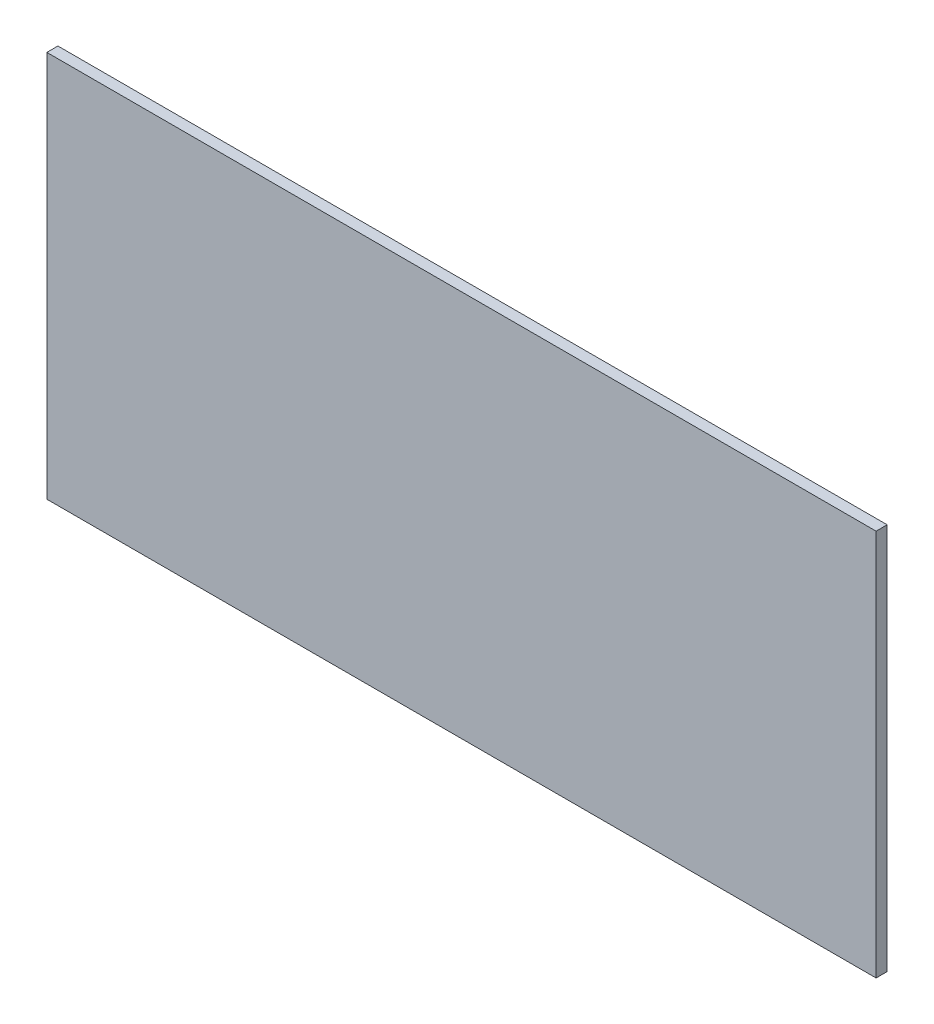
ISO-10303-21;
HEADER;
FILE_DESCRIPTION(('STEP AP214'),'2;1');
FILE_NAME('part.step','',(''),(''),'','','');
FILE_SCHEMA(('AUTOMOTIVE_DESIGN { 1 0 10303 214 1 1 1 1 }'));
ENDSEC;
DATA;
#1=APPLICATION_CONTEXT('core data for automotive mechanical design processes');
#2=APPLICATION_PROTOCOL_DEFINITION('international standard','automotive_design',2000,#1);
#3=PRODUCT_CONTEXT('',#1,'mechanical');
#4=PRODUCT('Part','Part','',(#3));
#5=PRODUCT_RELATED_PRODUCT_CATEGORY('part','',(#4));
#6=PRODUCT_DEFINITION_FORMATION('','',#4);
#7=PRODUCT_DEFINITION_CONTEXT('part definition',#1,'design');
#8=PRODUCT_DEFINITION('design','',#6,#7);
#9=PRODUCT_DEFINITION_SHAPE('','',#8);
#10=(LENGTH_UNIT() NAMED_UNIT(*) SI_UNIT(.MILLI.,.METRE.));
#11=(NAMED_UNIT(*) PLANE_ANGLE_UNIT() SI_UNIT($,.RADIAN.));
#12=(NAMED_UNIT(*) SI_UNIT($,.STERADIAN.) SOLID_ANGLE_UNIT());
#13=UNCERTAINTY_MEASURE_WITH_UNIT(LENGTH_MEASURE(1.E-05),#10,'distance_accuracy_value','');
#14=(GEOMETRIC_REPRESENTATION_CONTEXT(3) GLOBAL_UNCERTAINTY_ASSIGNED_CONTEXT((#13)) GLOBAL_UNIT_ASSIGNED_CONTEXT((#10,
#11,#12)) REPRESENTATION_CONTEXT('',''));
#15=CARTESIAN_POINT('',(0.,0.,0.));
#16=DIRECTION('',(0.,0.,1.));
#17=DIRECTION('',(1.,0.,0.));
#18=AXIS2_PLACEMENT_3D('',#15,#16,#17);
#19=CARTESIAN_POINT('',(0.,140.,4.));
#20=DIRECTION('',(1.,0.,0.));
#21=DIRECTION('',(0.,0.,-1.));
#22=AXIS2_PLACEMENT_3D('',#19,#20,#21);
#23=PLANE('',#22);
#24=DIRECTION('',(0.,-1.,0.));
#25=VECTOR('',#24,1.);
#26=CARTESIAN_POINT('',(0.,140.,0.));
#27=LINE('',#26,#25);
#28=CARTESIAN_POINT('',(0.,140.,0.));
#29=VERTEX_POINT('',#28);
#30=CARTESIAN_POINT('',(0.,0.,0.));
#31=VERTEX_POINT('',#30);
#32=EDGE_CURVE('E101',#29,#31,#27,.T.);
#33=ORIENTED_EDGE('',*,*,#32,.T.);
#34=DIRECTION('',(0.,0.,-1.));
#35=VECTOR('',#34,1.);
#36=CARTESIAN_POINT('',(0.,0.,4.));
#37=LINE('',#36,#35);
#38=CARTESIAN_POINT('',(0.,0.,4.));
#39=VERTEX_POINT('',#38);
#40=EDGE_CURVE('E11',#39,#31,#37,.T.);
#41=ORIENTED_EDGE('',*,*,#40,.F.);
#42=DIRECTION('',(0.,-1.,0.));
#43=VECTOR('',#42,1.);
#44=CARTESIAN_POINT('',(0.,140.,4.));
#45=LINE('',#44,#43);
#46=CARTESIAN_POINT('',(0.,140.,4.));
#47=VERTEX_POINT('',#46);
#48=EDGE_CURVE('E95',#47,#39,#45,.T.);
#49=ORIENTED_EDGE('',*,*,#48,.F.);
#50=DIRECTION('',(0.,0.,-1.));
#51=VECTOR('',#50,1.);
#52=CARTESIAN_POINT('',(0.,140.,4.));
#53=LINE('',#52,#51);
#54=EDGE_CURVE('E99',#47,#29,#53,.T.);
#55=ORIENTED_EDGE('',*,*,#54,.T.);
#56=EDGE_LOOP('',(#33,#41,#49,#55));
#57=FACE_BOUND('',#56,.T.);
#58=ADVANCED_FACE('F41',(#57),#23,.F.);
#59=CARTESIAN_POINT('',(0.,0.,4.));
#60=DIRECTION('',(0.,1.,0.));
#61=DIRECTION('',(0.,0.,1.));
#62=AXIS2_PLACEMENT_3D('',#59,#60,#61);
#63=PLANE('',#62);
#64=DIRECTION('',(1.,0.,0.));
#65=VECTOR('',#64,1.);
#66=CARTESIAN_POINT('',(0.,0.,0.));
#67=LINE('',#66,#65);
#68=CARTESIAN_POINT('',(300.,0.,0.));
#69=VERTEX_POINT('',#68);
#70=EDGE_CURVE('E96',#31,#69,#67,.T.);
#71=ORIENTED_EDGE('',*,*,#70,.T.);
#72=DIRECTION('',(0.,0.,-1.));
#73=VECTOR('',#72,1.);
#74=CARTESIAN_POINT('',(300.,0.,4.));
#75=LINE('',#74,#73);
#76=CARTESIAN_POINT('',(300.,0.,4.));
#77=VERTEX_POINT('',#76);
#78=EDGE_CURVE('E47',#77,#69,#75,.T.);
#79=ORIENTED_EDGE('',*,*,#78,.F.);
#80=DIRECTION('',(1.,0.,0.));
#81=VECTOR('',#80,1.);
#82=CARTESIAN_POINT('',(0.,0.,4.));
#83=LINE('',#82,#81);
#84=EDGE_CURVE('E90',#39,#77,#83,.T.);
#85=ORIENTED_EDGE('',*,*,#84,.F.);
#86=ORIENTED_EDGE('',*,*,#40,.T.);
#87=EDGE_LOOP('',(#71,#79,#85,#86));
#88=FACE_BOUND('',#87,.T.);
#89=ADVANCED_FACE('F94',(#88),#63,.F.);
#90=CARTESIAN_POINT('',(300.,0.,4.));
#91=DIRECTION('',(-1.,0.,0.));
#92=DIRECTION('',(0.,0.,1.));
#93=AXIS2_PLACEMENT_3D('',#90,#91,#92);
#94=PLANE('',#93);
#95=DIRECTION('',(0.,1.,0.));
#96=VECTOR('',#95,1.);
#97=CARTESIAN_POINT('',(300.,0.,0.));
#98=LINE('',#97,#96);
#99=CARTESIAN_POINT('',(300.,140.,0.));
#100=VERTEX_POINT('',#99);
#101=EDGE_CURVE('E71',#69,#100,#98,.T.);
#102=ORIENTED_EDGE('',*,*,#101,.T.);
#103=DIRECTION('',(0.,0.,-1.));
#104=VECTOR('',#103,1.);
#105=CARTESIAN_POINT('',(300.,140.,4.));
#106=LINE('',#105,#104);
#107=CARTESIAN_POINT('',(300.,140.,4.));
#108=VERTEX_POINT('',#107);
#109=EDGE_CURVE('E100',#108,#100,#106,.T.);
#110=ORIENTED_EDGE('',*,*,#109,.F.);
#111=DIRECTION('',(0.,1.,0.));
#112=VECTOR('',#111,1.);
#113=CARTESIAN_POINT('',(300.,0.,4.));
#114=LINE('',#113,#112);
#115=EDGE_CURVE('E89',#77,#108,#114,.T.);
#116=ORIENTED_EDGE('',*,*,#115,.F.);
#117=ORIENTED_EDGE('',*,*,#78,.T.);
#118=EDGE_LOOP('',(#102,#110,#116,#117));
#119=FACE_BOUND('',#118,.T.);
#120=ADVANCED_FACE('F97',(#119),#94,.F.);
#121=CARTESIAN_POINT('',(300.,140.,4.));
#122=DIRECTION('',(0.,-1.,0.));
#123=DIRECTION('',(0.,0.,-1.));
#124=AXIS2_PLACEMENT_3D('',#121,#122,#123);
#125=PLANE('',#124);
#126=DIRECTION('',(-1.,0.,0.));
#127=VECTOR('',#126,1.);
#128=CARTESIAN_POINT('',(300.,140.,0.));
#129=LINE('',#128,#127);
#130=EDGE_CURVE('E79',#100,#29,#129,.T.);
#131=ORIENTED_EDGE('',*,*,#130,.T.);
#132=ORIENTED_EDGE('',*,*,#54,.F.);
#133=DIRECTION('',(-1.,0.,0.));
#134=VECTOR('',#133,1.);
#135=CARTESIAN_POINT('',(300.,140.,4.));
#136=LINE('',#135,#134);
#137=EDGE_CURVE('E60',#108,#47,#136,.T.);
#138=ORIENTED_EDGE('',*,*,#137,.F.);
#139=ORIENTED_EDGE('',*,*,#109,.T.);
#140=EDGE_LOOP('',(#131,#132,#138,#139));
#141=FACE_BOUND('',#140,.T.);
#142=ADVANCED_FACE('F112',(#141),#125,.F.);
#143=CARTESIAN_POINT('',(0.,0.,4.));
#144=DIRECTION('',(0.,0.,1.));
#145=DIRECTION('',(1.,0.,0.));
#146=AXIS2_PLACEMENT_3D('',#143,#144,#145);
#147=PLANE('',#146);
#148=ORIENTED_EDGE('',*,*,#48,.T.);
#149=ORIENTED_EDGE('',*,*,#84,.T.);
#150=ORIENTED_EDGE('',*,*,#115,.T.);
#151=ORIENTED_EDGE('',*,*,#137,.T.);
#152=EDGE_LOOP('',(#148,#149,#150,#151));
#153=FACE_BOUND('',#152,.T.);
#154=ADVANCED_FACE('F88',(#153),#147,.T.);
#155=CARTESIAN_POINT('',(0.,0.,0.));
#156=DIRECTION('',(0.,0.,1.));
#157=DIRECTION('',(1.,0.,0.));
#158=AXIS2_PLACEMENT_3D('',#155,#156,#157);
#159=PLANE('',#158);
#160=ORIENTED_EDGE('',*,*,#32,.F.);
#161=ORIENTED_EDGE('',*,*,#130,.F.);
#162=ORIENTED_EDGE('',*,*,#101,.F.);
#163=ORIENTED_EDGE('',*,*,#70,.F.);
#164=EDGE_LOOP('',(#160,#161,#162,#163));
#165=FACE_BOUND('',#164,.T.);
#166=ADVANCED_FACE('F114',(#165),#159,.F.);
#167=CLOSED_SHELL('',(#58,#89,#120,#142,#154,#166));
#168=MANIFOLD_SOLID_BREP('B2',#167);
#169=ADVANCED_BREP_SHAPE_REPRESENTATION('',(#18,#168),#14);
#170=SHAPE_DEFINITION_REPRESENTATION(#9,#169);
ENDSEC;
END-ISO-10303-21;
